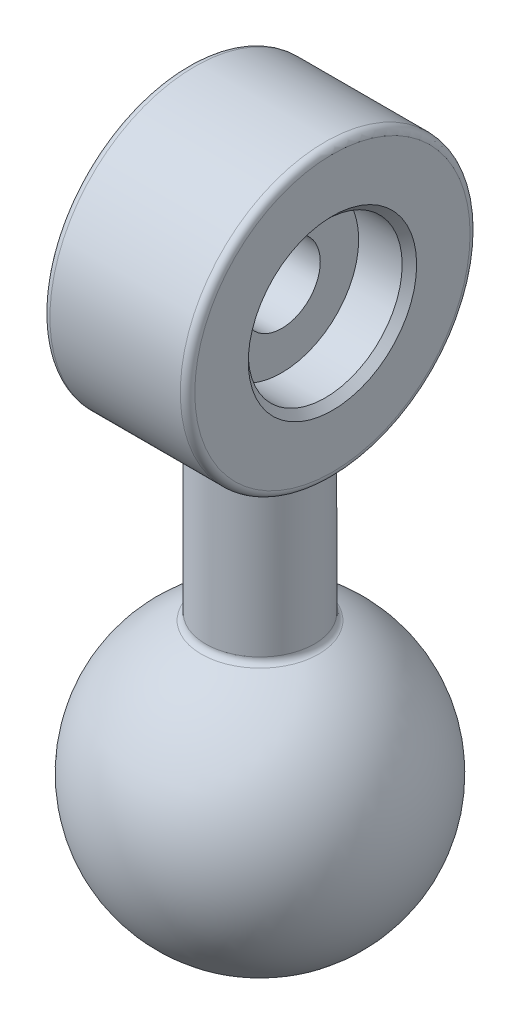
ISO-10303-21;
HEADER;
FILE_DESCRIPTION(('STEP AP214'),'2;1');
FILE_NAME('part.step','',(''),(''),'','','');
FILE_SCHEMA(('AUTOMOTIVE_DESIGN { 1 0 10303 214 1 1 1 1 }'));
ENDSEC;
DATA;
#1=APPLICATION_CONTEXT('core data for automotive mechanical design processes');
#2=APPLICATION_PROTOCOL_DEFINITION('international standard','automotive_design',2000,#1);
#3=PRODUCT_CONTEXT('',#1,'mechanical');
#4=PRODUCT('Part','Part','',(#3));
#5=PRODUCT_RELATED_PRODUCT_CATEGORY('part','',(#4));
#6=PRODUCT_DEFINITION_FORMATION('','',#4);
#7=PRODUCT_DEFINITION_CONTEXT('part definition',#1,'design');
#8=PRODUCT_DEFINITION('design','',#6,#7);
#9=PRODUCT_DEFINITION_SHAPE('','',#8);
#10=(LENGTH_UNIT() NAMED_UNIT(*) SI_UNIT(.MILLI.,.METRE.));
#11=(NAMED_UNIT(*) PLANE_ANGLE_UNIT() SI_UNIT($,.RADIAN.));
#12=(NAMED_UNIT(*) SI_UNIT($,.STERADIAN.) SOLID_ANGLE_UNIT());
#13=UNCERTAINTY_MEASURE_WITH_UNIT(LENGTH_MEASURE(1.E-05),#10,'distance_accuracy_value','');
#14=(GEOMETRIC_REPRESENTATION_CONTEXT(3) GLOBAL_UNCERTAINTY_ASSIGNED_CONTEXT((#13)) GLOBAL_UNIT_ASSIGNED_CONTEXT((#10,
#11,#12)) REPRESENTATION_CONTEXT('',''));
#15=CARTESIAN_POINT('',(0.,0.,0.));
#16=DIRECTION('',(0.,0.,1.));
#17=DIRECTION('',(1.,0.,0.));
#18=AXIS2_PLACEMENT_3D('',#15,#16,#17);
#19=CARTESIAN_POINT('',(0.,12.7,0.));
#20=DIRECTION('',(0.,-1.,0.));
#21=DIRECTION('',(1.,0.,0.));
#22=AXIS2_PLACEMENT_3D('',#19,#20,#21);
#23=CYLINDRICAL_SURFACE('',#22,4.7625);
#24=CARTESIAN_POINT('',(0.,12.1938188747414,0.));
#25=DIRECTION('',(0.,-1.,0.));
#26=DIRECTION('',(1.,0.,0.));
#27=AXIS2_PLACEMENT_3D('',#24,#25,#26);
#28=CIRCLE('',#27,4.7625);
#29=CARTESIAN_POINT('',(4.7625,12.1938188747414,0.));
#30=VERTEX_POINT('',#29);
#31=EDGE_CURVE('E93',#30,#30,#28,.F.);
#32=ORIENTED_EDGE('',*,*,#31,.T.);
#33=EDGE_LOOP('',(#32));
#34=FACE_BOUND('',#33,.T.);
#35=CARTESIAN_POINT('',(4.76160021114497,24.7654127276796,0.0925725619404737));
#36=CARTESIAN_POINT('',(4.76169728884381,25.4002959809423,0.0875792336624714));
#37=CARTESIAN_POINT('',(5.39648023929763,25.4003930739805,0.0999195906659081));
#38=CARTESIAN_POINT('',(4.75671349722739,24.7676521384673,0.34398511734036));
#39=CARTESIAN_POINT('',(4.75733065655545,25.4019054404997,0.32536694928873));
#40=CARTESIAN_POINT('',(5.39094196351998,25.4025258461416,0.371285523477689));
#41=CARTESIAN_POINT('',(4.73184615421316,24.779104108414,0.594922440310121));
#42=CARTESIAN_POINT('',(4.73535906975175,25.4100339643585,0.562187155455623));
#43=CARTESIAN_POINT('',(5.36275897479677,25.4134324842582,0.642138507000814));
#44=CARTESIAN_POINT('',(4.64318089462739,24.8192389613458,1.08867277054386));
#45=CARTESIAN_POINT('',(4.65556998617361,25.4391292165822,1.03276221560952));
#46=CARTESIAN_POINT('',(5.26227168060252,25.451656153727,1.17507537138074));
#47=CARTESIAN_POINT('',(4.57938242883946,24.8479220874173,1.33148566314239));
#48=CARTESIAN_POINT('',(4.59825696620242,25.4599136751024,1.26509565989003));
#49=CARTESIAN_POINT('',(5.18996675268622,25.4789734165902,1.43715912847165));
#50=CARTESIAN_POINT('',(4.41519911832528,24.9196804027605,1.80270128618317));
#51=CARTESIAN_POINT('',(4.44762658824141,25.5131925412687,1.72170972134861));
#52=CARTESIAN_POINT('',(5.00389233410048,25.5473146692934,1.94577281683213));
#53=CARTESIAN_POINT('',(4.31479686422814,24.9627624395807,2.03109709888135));
#54=CARTESIAN_POINT('',(4.35509046453569,25.5454229073273,1.94502683616064));
#55=CARTESIAN_POINT('',(4.89010311281071,25.5883451806082,2.19229528133033));
#56=CARTESIAN_POINT('',(4.08056481885774,25.0592465381688,2.46818364783341));
#57=CARTESIAN_POINT('',(4.13476584976329,25.6193052093867,2.37775918044391));
#58=CARTESIAN_POINT('',(4.62464012805923,25.6802347983012,2.66407123893372));
#59=CARTESIAN_POINT('',(3.94672526574617,25.1126516126595,2.67686860504849));
#60=CARTESIAN_POINT('',(4.00783395725522,25.6607071983308,2.58678424480375));
#61=CARTESIAN_POINT('',(4.47295530118076,25.7310967739391,2.88931849434626));
#62=CARTESIAN_POINT('',(3.63962420134126,25.2285003731643,3.0827467709815));
#63=CARTESIAN_POINT('',(3.71160655619891,25.752241337624,2.99734247942161));
#64=CARTESIAN_POINT('',(4.12490742818487,25.8414289268468,3.32740921311417));
#65=CARTESIAN_POINT('',(3.4644061707386,25.2913019500108,3.27838077100381));
#66=CARTESIAN_POINT('',(3.54080478140343,25.8026425431375,3.19798137953026));
#67=CARTESIAN_POINT('',(3.92632699351909,25.9012399525402,3.53856972105023));
#68=CARTESIAN_POINT('',(3.08419416457309,25.4167541407614,3.63837126172373));
#69=CARTESIAN_POINT('',(3.16482052103659,25.9048593269133,3.56995700381185));
#70=CARTESIAN_POINT('',(3.49542005319971,26.0207182293587,3.9271308856708));
#71=CARTESIAN_POINT('',(2.87918746982788,25.4794046784994,3.80271432219471));
#72=CARTESIAN_POINT('',(2.96008196465791,25.9566935937198,3.74196702142598));
#73=CARTESIAN_POINT('',(3.26307913247276,26.0803854079446,4.10451704623769));
#74=CARTESIAN_POINT('',(2.43433692973659,25.6004601238947,4.10248714434976));
#75=CARTESIAN_POINT('',(2.51160872839779,26.0577403523314,4.05681122410529));
#76=CARTESIAN_POINT('',(2.75891518703359,26.1956763086277,4.42808136209344));
#77=CARTESIAN_POINT('',(2.19336601197279,25.6585620354233,4.23634926571035));
#78=CARTESIAN_POINT('',(2.26632315294292,26.106997209439,4.19922188654344));
#79=CARTESIAN_POINT('',(2.48581481358261,26.2510114630156,4.57256746114965));
#80=CARTESIAN_POINT('',(1.689904907561,25.7598716057473,4.46111197614404));
#81=CARTESIAN_POINT('',(1.75095608719781,26.1931830046256,4.43834805008958));
#82=CARTESIAN_POINT('',(1.91522556191862,26.3474967681029,4.81516848193267));
#83=CARTESIAN_POINT('',(1.42742579842872,25.8030868727705,4.5520345195068));
#84=CARTESIAN_POINT('',(1.48012903558784,26.2304571521496,4.5361751650174));
#85=CARTESIAN_POINT('',(1.61774923822344,26.3886541647342,4.91330710035291));
#86=CARTESIAN_POINT('',(0.901691616315077,25.8668400183897,4.68382063374012));
#87=CARTESIAN_POINT('',(0.936732135078477,26.2853584225207,4.67753636481585));
#88=CARTESIAN_POINT('',(1.02191716515306,26.4493714459038,5.05555243013259));
#89=CARTESIAN_POINT('',(0.639087614375632,25.8883732879622,4.72689192516858));
#90=CARTESIAN_POINT('',(0.663777969262695,26.3041010872507,4.72414403648034));
#91=CARTESIAN_POINT('',(0.724299296291312,26.4698793218159,5.10204207797858));
#92=CARTESIAN_POINT('',(0.109776610150447,25.9092254310623,4.76862424884515));
#93=CARTESIAN_POINT('',(0.114421892636814,26.322150825222,4.76905658178594));
#94=CARTESIAN_POINT('',(0.124413491504909,26.4897385058265,5.14708649079815));
#95=CARTESIAN_POINT('',(-0.156928347761278,25.9085550360591,4.7673067350731));
#96=CARTESIAN_POINT('',(-0.163440299278602,26.3215645185828,4.76762658028095));
#97=CARTESIAN_POINT('',(-0.177852127462522,26.4891000343717,5.14566441244833));
#98=CARTESIAN_POINT('',(-0.667039893605834,25.8859438258853,4.72200566546161));
#99=CARTESIAN_POINT('',(-0.692740492424099,26.3019991789572,4.71888603541801));
#100=CARTESIAN_POINT('',(-0.755978546086853,26.4675655484345,5.09676801987404));
#101=CARTESIAN_POINT('',(-0.910766103338871,25.8655018956856,4.68102856770365));
#102=CARTESIAN_POINT('',(-0.945923880446525,26.2842252088083,4.67458151548522));
#103=CARTESIAN_POINT('',(-1.03220158378406,26.4480970434491,5.05253877151469));
#104=CARTESIAN_POINT('',(-1.26809870901329,25.8225204005734,4.59221784290909));
#105=CARTESIAN_POINT('',(-1.31459403862944,26.2472794724181,4.57950642927386));
#106=CARTESIAN_POINT('',(-1.43717853688172,26.4071622862909,4.95667957646077));
#107=CARTESIAN_POINT('',(-1.38586862371241,25.8061331562759,4.5580419432182));
#108=CARTESIAN_POINT('',(-1.43617066958828,26.2331751323223,4.5428481195451));
#109=CARTESIAN_POINT('',(-1.57065110687412,26.391555387014,4.91979130375615));
#110=CARTESIAN_POINT('',(-1.61813089275028,25.7697380566573,4.48085245280992));
#111=CARTESIAN_POINT('',(-1.67536979592012,26.2019693954162,4.46029899271183));
#112=CARTESIAN_POINT('',(-1.8338816784504,26.3568933873759,4.8364756633159));
#113=CARTESIAN_POINT('',(-1.73262067704509,25.7497274476186,4.437832137043));
#114=CARTESIAN_POINT('',(-1.79308523415219,26.1848370610692,4.4143193509933));
#115=CARTESIAN_POINT('',(-1.96363676731782,26.3378356644264,4.79004103679667));
#116=CARTESIAN_POINT('',(-2.07512541812269,25.6841091085173,4.29388460646487));
#117=CARTESIAN_POINT('',(-2.14520041136046,26.1287428835067,4.26052385886539));
#118=CARTESIAN_POINT('',(-2.3518088072056,26.275342008055,4.63466909906525));
#119=CARTESIAN_POINT('',(-2.29685841974343,25.6335902913298,4.17939597175186));
#120=CARTESIAN_POINT('',(-2.37149614020674,26.085801680724,4.13856898321141));
#121=CARTESIAN_POINT('',(-2.60310620904217,26.2272288488883,4.51109406474882));
#122=CARTESIAN_POINT('',(-2.71880121185712,25.525055109278,3.91805940138155));
#123=CARTESIAN_POINT('',(-2.79863736268247,25.9947473339972,3.86312406636827));
#124=CARTESIAN_POINT('',(-3.08130804010512,26.1238620088335,4.22901649672851));
#125=CARTESIAN_POINT('',(-2.91900120141325,25.4670353565322,3.77119682240669));
#126=CARTESIAN_POINT('',(-2.99964083101476,25.9464383600981,3.70879848936023));
#127=CARTESIAN_POINT('',(-3.30820136160311,26.0686051013915,4.07049815753902));
#128=CARTESIAN_POINT('',(-3.2076263060765,25.3763001446219,3.5228386233767));
#129=CARTESIAN_POINT('',(-3.28573117193371,25.8722136463573,3.45180179626927));
#130=CARTESIAN_POINT('',(-3.63530981355259,25.9821906139622,3.80242899030018));
#131=CARTESIAN_POINT('',(-3.30512809180557,25.3442129467699,3.4315223695185));
#132=CARTESIAN_POINT('',(-3.38216722006003,25.8460435097226,3.35731407836072));
#133=CARTESIAN_POINT('',(-3.74581183737738,25.951631377988,3.70386541468373));
#134=CARTESIAN_POINT('',(-3.49207404986882,25.2803941545397,3.24108342155801));
#135=CARTESIAN_POINT('',(-3.56609510644504,25.7943696222559,3.16137022274871));
#136=CARTESIAN_POINT('',(-3.95768392318859,25.8908515758677,3.49831226450775));
#137=CARTESIAN_POINT('',(-3.58152573349093,25.2486622533736,3.14196816978912));
#138=CARTESIAN_POINT('',(-3.65352177567541,25.7688683203577,3.05984181168535));
#139=CARTESIAN_POINT('',(-4.059062497968,25.8606307175429,3.39133072294296));
#140=CARTESIAN_POINT('',(-3.83718140487939,25.1552004517544,2.83349383987905));
#141=CARTESIAN_POINT('',(-3.90312353668402,25.6940089326229,2.7443220636457));
#142=CARTESIAN_POINT('',(-4.34880559221071,25.7716194777772,3.05837430339784));
#143=CARTESIAN_POINT('',(-3.99073171839862,25.0951894801341,2.6129668238656));
#144=CARTESIAN_POINT('',(-4.04966769469722,25.6470983032872,2.52209644298531));
#145=CARTESIAN_POINT('',(-4.52282928084004,25.7144661715013,2.82034514322896));
#146=CARTESIAN_POINT('',(-4.26168239235133,24.9852673376999,2.1434300294371));
#147=CARTESIAN_POINT('',(-4.30594331014163,25.562350494022,2.05505006722837));
#148=CARTESIAN_POINT('',(-4.82990671134346,25.609778416913,2.31354352382776));
#149=CARTESIAN_POINT('',(-4.37837817109444,24.9355586225651,1.89397697810266));
#150=CARTESIAN_POINT('',(-4.41377599957116,25.5250254077952,1.81033943415483));
#151=CARTESIAN_POINT('',(-4.96216192730316,25.5624367835341,2.04429261128632));
#152=CARTESIAN_POINT('',(-4.56748116710627,24.8532901735679,1.37668438474408));
#153=CARTESIAN_POINT('',(-4.58766762292129,25.4637683090104,1.30809698859467));
#154=CARTESIAN_POINT('',(-5.17647865611912,25.4840858797159,1.48594505020631));
#155=CARTESIAN_POINT('',(-4.63990055330905,24.8207257281123,1.10884991720158));
#156=CARTESIAN_POINT('',(-4.65264056456864,25.4401999310082,1.05179149052638));
#157=CARTESIAN_POINT('',(-5.25855396043399,25.4530721220451,1.19685387888603));
#158=CARTESIAN_POINT('',(-4.73831547845026,24.7761736751352,0.556901892015311));
#159=CARTESIAN_POINT('',(-4.7412258662538,25.4078920596229,0.525738239229741));
#160=CARTESIAN_POINT('',(-5.3700908755595,25.4106415953327,0.601100454871842));
#161=CARTESIAN_POINT('',(-4.76318779690183,24.7646841758373,0.272554266767622));
#162=CARTESIAN_POINT('',(-4.76311351557422,25.3997733666098,0.257907104336385));
#163=CARTESIAN_POINT('',(-5.39827950315317,25.3996992150783,0.29418555778018));
#164=CARTESIAN_POINT('',(-4.76178339040902,24.7653290413657,-0.295982573889904));
#165=CARTESIAN_POINT('',(-4.76186085645971,25.4002360836341,-0.280038905807839));
#166=CARTESIAN_POINT('',(-5.39668784246586,25.4003133727343,-0.319473254356612));
#167=CARTESIAN_POINT('',(-4.73551150415836,24.7774611713773,-0.580171801741082));
#168=CARTESIAN_POINT('',(-4.73873565750958,25.4088118980357,-0.547793795621143));
#169=CARTESIAN_POINT('',(-5.36691303803774,25.4118677822495,-0.626217182830492));
#170=CARTESIAN_POINT('',(-4.63669907835069,24.822157179617,-1.11913455758296));
#171=CARTESIAN_POINT('',(-4.6497320863497,25.4412488423844,-1.06175282606127));
#172=CARTESIAN_POINT('',(-5.25492562213862,25.4544354091727,-1.20795476056681));
#173=CARTESIAN_POINT('',(-4.56737946373317,24.8532963446609,-1.37460269049351));
#174=CARTESIAN_POINT('',(-4.58746775520272,25.4638140743519,-1.30634120672829));
#175=CARTESIAN_POINT('',(-5.1763633922632,25.4840917568769,-1.48369814212348));
#176=CARTESIAN_POINT('',(-4.38835681362064,24.9312533596625,-1.86891588224196));
#177=CARTESIAN_POINT('',(-4.42292566974529,25.5218254434385,-1.78608884855324));
#178=CARTESIAN_POINT('',(-4.97347105546782,25.5583365330687,-2.01724253956527));
#179=CARTESIAN_POINT('',(-4.27865226502484,24.978071797069,-2.10776031784169));
#180=CARTESIAN_POINT('',(-4.32159770069624,25.5569531854689,-2.02017169610945));
#181=CARTESIAN_POINT('',(-4.84913923370029,25.6029255210314,-2.27504288274886));
#182=CARTESIAN_POINT('',(-4.02297307700022,25.0823621972909,-2.56221205192086));
#183=CARTESIAN_POINT('',(-4.08025689826934,25.6371593947172,-2.47143524269704));
#184=CARTESIAN_POINT('',(-4.55936948726146,25.7022497116923,-2.76556221477262));
#185=CARTESIAN_POINT('',(-3.8770950990701,25.1398056659361,-2.77787911758332));
#186=CARTESIAN_POINT('',(-3.94135161076518,25.6819264496989,-2.68828528263316));
#187=CARTESIAN_POINT('',(-4.39404111228858,25.7569577770854,-2.99834571422301));
#188=CARTESIAN_POINT('',(-3.55289868772431,25.2597217892287,-3.18205522327389));
#189=CARTESIAN_POINT('',(-3.62707464348508,25.7772464383371,-3.0988967102396));
#190=CARTESIAN_POINT('',(-4.02661851276722,25.8711636087863,-3.4345992886238));
#191=CARTESIAN_POINT('',(-3.3745709159211,25.3221958886962,-3.37055641746374));
#192=CARTESIAN_POINT('',(-3.45247099920679,25.8276610151511,-3.29292313112838));
#193=CARTESIAN_POINT('',(-3.82451370471284,25.9306627511133,-3.63806089505036));
#194=CARTESIAN_POINT('',(-2.98064842274342,25.4488054217339,-3.72429754530806));
#195=CARTESIAN_POINT('',(-3.06171624166185,25.931232448334,-3.65938461830518));
#196=CARTESIAN_POINT('',(-3.37806821244018,26.0512432588213,-4.01987671556));
#197=CARTESIAN_POINT('',(-2.76371644993035,25.5128850200816,-3.88806798247855));
#198=CARTESIAN_POINT('',(-2.84426840957751,25.9845059542201,-3.83137324777994));
#199=CARTESIAN_POINT('',(-3.13221197659228,26.1122714478046,-4.19664480645312));
#200=CARTESIAN_POINT('',(-2.30378269667533,25.6323584005888,-4.17704685875705));
#201=CARTESIAN_POINT('',(-2.37895417821794,26.0846611578281,-4.13579975299356));
#202=CARTESIAN_POINT('',(-2.61095372290533,26.2260556197171,-4.50855851418356));
#203=CARTESIAN_POINT('',(-2.06078224177615,25.6877526240343,-4.30225725733254));
#204=CARTESIAN_POINT('',(-2.13088936306586,26.1317915988854,-4.26931411595869));
#205=CARTESIAN_POINT('',(-2.33555320734807,26.2788120229186,-4.64370624600166));
#206=CARTESIAN_POINT('',(-1.5569350459844,25.7823561765027,-4.50897154025487));
#207=CARTESIAN_POINT('',(-1.61404162795298,26.2124873815621,-4.48963435128619));
#208=CARTESIAN_POINT('',(-1.76452638544724,26.3689106442597,-4.86682642441008));
#209=CARTESIAN_POINT('',(-1.2962591145134,25.8217001552185,-4.59084083038273));
#210=CARTESIAN_POINT('',(-1.34464731440635,26.246488884981,-4.57782721363825));
#211=CARTESIAN_POINT('',(-1.4690936631147,26.4063811002009,-4.95519327724048));
#212=CARTESIAN_POINT('',(-0.763068407396265,25.8792389471773,-4.70887934454273));
#213=CARTESIAN_POINT('',(-0.793076151929948,26.2960895335436,-4.70451691291247));
#214=CARTESIAN_POINT('',(-0.864810861716258,26.4611799496999,-5.08259992744096));
#215=CARTESIAN_POINT('',(-0.490562618869457,25.8974495335178,-4.745082653547));
#216=CARTESIAN_POINT('',(-0.509549952911788,26.3119618203602,-4.74373231377325));
#217=CARTESIAN_POINT('',(-0.555970968052261,26.4785233652551,-5.12167651493967));
#218=CARTESIAN_POINT('',(0.035416278730027,25.9094698039888,-4.76906074639504));
#219=CARTESIAN_POINT('',(0.0365504375934303,26.3223771357628,-4.76955869134069));
#220=CARTESIAN_POINT('',(0.0401384492275568,26.4899712418941,-5.14755763102951));
#221=CARTESIAN_POINT('',(0.288699121021072,25.9050873392194,-4.76042320016322));
#222=CARTESIAN_POINT('',(0.300319664905804,26.3185532630156,-4.76019727882508));
#223=CARTESIAN_POINT('',(0.32719233715754,26.4857974659292,-5.13823456525366));
#224=CARTESIAN_POINT('',(0.789805850299065,25.8766632136489,-4.70332088065582));
#225=CARTESIAN_POINT('',(0.820135290896056,26.2939612964592,-4.69876232511961));
#226=CARTESIAN_POINT('',(0.895113297005281,26.4587268701358,-5.07660031563039));
#227=CARTESIAN_POINT('',(1.03762968743884,25.8526213734109,-4.65485574386195));
#228=CARTESIAN_POINT('',(1.07740361195584,26.2730753212356,-4.6463929682494));
#229=CARTESIAN_POINT('',(1.17598031242958,26.4358298794151,-5.02428873941401));
#230=CARTESIAN_POINT('',(1.51586984390942,25.7886350400067,-4.52148848311657));
#231=CARTESIAN_POINT('',(1.57103082704111,26.2180663255292,-4.5035118427594));
#232=CARTESIAN_POINT('',(1.71798582309843,26.3748905143154,-4.88033677542011));
#233=CARTESIAN_POINT('',(1.74654332267429,25.7490372703599,-4.43737783469318));
#234=CARTESIAN_POINT('',(1.80865705287863,26.1840083870115,-4.41321895450279));
#235=CARTESIAN_POINT('',(1.97941576570151,26.3371783528103,-4.78955067868933));
#236=CARTESIAN_POINT('',(2.07954935172759,25.681127158277,-4.28623323221949));
#237=CARTESIAN_POINT('',(2.14841434622565,26.1264269684226,-4.25293683405351));
#238=CARTESIAN_POINT('',(2.35682259862678,26.2725020556159,-4.6264104728318));
#239=CARTESIAN_POINT('',(2.18841518335236,25.6570629139467,-4.23166815764133));
#240=CARTESIAN_POINT('',(2.25950818398707,26.1060170216739,-4.1949761972627));
#241=CARTESIAN_POINT('',(2.48020387446656,26.2495837276801,-4.56751483677769));
#242=CARTESIAN_POINT('',(2.40144771282884,25.606697144144,-4.1145156166853));
#243=CARTESIAN_POINT('',(2.47617194716513,26.0635086371442,-4.07100144658987));
#244=CARTESIAN_POINT('',(2.72164074120547,26.2016163278226,-4.44106447512634));
#245=CARTESIAN_POINT('',(2.50561025545854,25.5803936973791,-4.05192123714274));
#246=CARTESIAN_POINT('',(2.58177428251924,26.0413828248686,-4.00488377516094));
#247=CARTESIAN_POINT('',(2.83969162285301,26.1765654260984,-4.37350228770057));
#248=CARTESIAN_POINT('',(2.82428438314505,25.4953368933358,-3.84344982490844));
#249=CARTESIAN_POINT('',(2.90490761285503,25.969947304423,-3.78468237903182));
#250=CARTESIAN_POINT('',(3.20085563423106,26.0955589459846,-4.14848552531734));
#251=CARTESIAN_POINT('',(3.02944295802602,25.433727262574,-3.68387602264454));
#252=CARTESIAN_POINT('',(3.11021037109956,25.9188494760525,-3.6174076528212));
#253=CARTESIAN_POINT('',(3.43336868576037,26.0368831072064,-3.97624713555517));
#254=CARTESIAN_POINT('',(3.41106979640655,25.3097236151203,-3.33363211514625));
#255=CARTESIAN_POINT('',(3.48838439798186,25.8175531014722,-3.25487743920013));
#256=CARTESIAN_POINT('',(3.86587910259656,25.9187843953596,-3.59820609253648));
#257=CARTESIAN_POINT('',(3.58753210233346,25.2473294384395,-3.14295556915258));
#258=CARTESIAN_POINT('',(3.66084573762264,25.7673200639599,-3.05892044018675));
#259=CARTESIAN_POINT('',(4.06586971598777,25.8593613699208,-3.39239648734933));
#260=CARTESIAN_POINT('',(3.83197145315408,25.1562035213272,-2.83128228755551));
#261=CARTESIAN_POINT('',(3.89638353927827,25.6953411747511,-2.74409105548119));
#262=CARTESIAN_POINT('',(4.34290098023609,25.7725747822278,-3.055987231007));
#263=CARTESIAN_POINT('',(3.91183803506605,25.1254846333534,-2.71988116497078));
#264=CARTESIAN_POINT('',(3.97303781740484,25.6712077897485,-2.63172096349193));
#265=CARTESIAN_POINT('',(4.43341643972631,25.7433186984686,-2.93574474947544));
#266=CARTESIAN_POINT('',(4.06181643457574,25.066424682189,-2.49034526353326));
#267=CARTESIAN_POINT('',(4.11614758427143,25.6251729983031,-2.40164596938128));
#268=CARTESIAN_POINT('',(4.60339195920125,25.6870711259796,-2.68799171300928));
#269=CARTESIAN_POINT('',(4.13193715122157,25.0380814592691,-2.37221676834743));
#270=CARTESIAN_POINT('',(4.18247575233751,25.6033034533194,-2.2839573066583));
#271=CARTESIAN_POINT('',(4.68286210477378,25.6600775803648,-2.56048794044533));
#272=CARTESIAN_POINT('',(4.26191596422415,24.9845488874036,-2.12987773026774));
#273=CARTESIAN_POINT('',(4.30473470257192,25.5623119013274,-2.04402518432444));
#274=CARTESIAN_POINT('',(4.83017142617778,25.6090941785638,-2.2989156453817));
#275=CARTESIAN_POINT('',(4.32177257953607,24.9593599937488,-2.00566631296542));
#276=CARTESIAN_POINT('',(4.36051604903449,25.5432332382316,-1.92184654692461));
#277=CARTESIAN_POINT('',(4.89800892349179,25.5851047559881,-2.16484617907606));
#278=CARTESIAN_POINT('',(4.43066508930617,24.9128608785208,-1.75205372250428));
#279=CARTESIAN_POINT('',(4.46148541107622,25.508252727876,-1.67379481282613));
#280=CARTESIAN_POINT('',(5.02142043453113,25.5408198842913,-1.89110560523748));
#281=CARTESIAN_POINT('',(4.4796990350779,24.8915513555723,-1.62265161968015));
#282=CARTESIAN_POINT('',(4.50652502261152,25.4923982280597,-1.5480412577313));
#283=CARTESIAN_POINT('',(5.07699223974515,25.5205251005272,-1.75143349425629));
#284=CARTESIAN_POINT('',(4.60657630664168,24.8358367951878,-1.23767836388544));
#285=CARTESIAN_POINT('',(4.62300555202934,25.4510335896133,-1.17468476595074));
#286=CARTESIAN_POINT('',(5.22078648087943,25.4674636144989,-1.33590680546682));
#287=CARTESIAN_POINT('',(4.66911219189657,24.8075519829106,-0.976123160799531));
#288=CARTESIAN_POINT('',(4.67892924362087,25.4306453472677,-0.92515592957113));
#289=CARTESIAN_POINT('',(5.29166048420095,25.4405256981583,-1.05359325292564));
#290=CARTESIAN_POINT('',(4.74922490993606,24.7711480071379,-0.445337778886643));
#291=CARTESIAN_POINT('',(4.75086679542421,25.4043224479337,-0.420286048501001));
#292=CARTESIAN_POINT('',(5.38245489797195,25.4058552450337,-0.480682047049408));
#293=CARTESIAN_POINT('',(4.76682262652465,24.763019476604,-0.176111223955646));
#294=CARTESIAN_POINT('',(4.76636789717581,25.3985744814613,-0.166761689160895));
#295=CARTESIAN_POINT('',(5.40239897673263,25.3981137872609,-0.190088305221118));
#296=CARTESIAN_POINT('',(4.76160021114497,24.7654127276796,0.0925725619404737));
#297=CARTESIAN_POINT('',(4.76169728884381,25.4002959809423,0.0875792336624714));
#298=CARTESIAN_POINT('',(5.39648023929763,25.4003930739805,0.0999195906659081));
#299=(BOUNDED_SURFACE() B_SPLINE_SURFACE(3,2,((#35,#36,#37),(#38,#39,#40),(#41,#42,#43),(#44,
#45,#46),(#47,#48,#49),(#50,#51,#52),(#53,#54,#55),(#56,#57,#58),(#59,#60,#61),(#62,#63,#64),
(#65,#66,#67),(#68,#69,#70),(#71,#72,#73),(#74,#75,#76),(#77,#78,#79),(#80,#81,#82),(#83,#84,
#85),(#86,#87,#88),(#89,#90,#91),(#92,#93,#94),(#95,#96,#97),(#98,#99,#100),(#101,#102,#103),
(#104,#105,#106),(#107,#108,#109),(#110,#111,#112),(#113,#114,#115),(#116,#117,#118),(#119,#120,
#121),(#122,#123,#124),(#125,#126,#127),(#128,#129,#130),(#131,#132,#133),(#134,#135,#136),
(#137,#138,#139),(#140,#141,#142),(#143,#144,#145),(#146,#147,#148),(#149,#150,#151),(#152,#153,
#154),(#155,#156,#157),(#158,#159,#160),(#161,#162,#163),(#164,#165,#166),(#167,#168,#169),
(#170,#171,#172),(#173,#174,#175),(#176,#177,#178),(#179,#180,#181),(#182,#183,#184),(#185,#186,
#187),(#188,#189,#190),(#191,#192,#193),(#194,#195,#196),(#197,#198,#199),(#200,#201,#202),
(#203,#204,#205),(#206,#207,#208),(#209,#210,#211),(#212,#213,#214),(#215,#216,#217),(#218,#219,
#220),(#221,#222,#223),(#224,#225,#226),(#227,#228,#229),(#230,#231,#232),(#233,#234,#235),
(#236,#237,#238),(#239,#240,#241),(#242,#243,#244),(#245,#246,#247),(#248,#249,#250),(#251,#252,
#253),(#254,#255,#256),(#257,#258,#259),(#260,#261,#262),(#263,#264,#265),(#266,#267,#268),
(#269,#270,#271),(#272,#273,#274),(#275,#276,#277),(#278,#279,#280),(#281,#282,#283),(#284,#285,
#286),(#287,#288,#289),(#290,#291,#292),(#293,#294,#295),(#296,#297,#298)),.UNSPECIFIED.,.T.,
.F.,.F.) B_SPLINE_SURFACE_WITH_KNOTS((4,2,2,2,2,2,2,2,2,2,2,2,2,2,2,2,2,2,2,2,2,2,2,2,2,2,2,2,2,
2,2,2,2,2,2,2,2,2,2,2,2,2,2,4),(3,3),(0.,0.853928586728634,1.70786922043644,2.56221653351225,
3.41681356072201,4.32540740691213,5.23439035131962,6.18289162055205,7.13090741048461,
8.03308845381461,8.93483346161649,9.77317476742652,10.1926050824994,10.6123555082369,
11.4703778630547,12.3287891160911,12.7925987083927,13.2559709481665,14.1825080207736,
15.1258145907041,16.0688617853543,17.0339241895805,17.9988952948126,18.8991553751147,
19.7994491888608,20.6973627121765,21.5955350464932,22.5350368002253,23.4744908043418,
24.405892850837,25.3365992890485,26.1940465613062,27.0515016598279,27.8908404382167,
28.3107657996192,28.7310551709979,29.6297503792419,30.5286319261906,31.0032022761781,
31.4773364035539,31.9515388880179,32.4258266859512,33.3388417848739,34.251432507331),(0.,1.),
.UNSPECIFIED.) GEOMETRIC_REPRESENTATION_ITEM() RATIONAL_B_SPLINE_SURFACE(((1.,0.707160848230135,
1.),(1.,0.707453910728993,1.),(1.,0.708958216842692,1.),(1.,0.714169158077318,1.),(1.,
0.71787582426777,1.),(1.,0.726994239401257,1.),(1.,0.732406799529583,1.),(1.,0.744288267214419,
1.),(1.,0.750757483064555,1.),(1.,0.764496707371946,1.),(1.,0.771791486591032,1.),(1.,
0.78605263019961,1.),(1.,0.793018852610217,1.),(1.,0.806231992654335,1.),(1.,0.812434471400834,
1.),(1.,0.823099171821771,1.),(1.,0.827562282601556,1.),(1.,0.834099909168628,1.),(1.,
0.836279476258746,1.),(1.,0.838390623270339,1.),(1.,0.838323289163364,1.),(1.,0.83603300198623,
1.),(1.,0.833961948178457,1.),(1.,0.829555445344802,1.),(1.,0.827869234212412,1.),(1.,
0.824100687926908,1.),(1.,0.822018051432758,1.),(1.,0.815138230050233,1.),(1.,0.80977720147185,
1.),(1.,0.798033459071048,1.),(1.,0.791650283271627,1.),(1.,0.781460446332821,1.),(1.,
0.77781824189981,1.),(1.,0.770495167125061,1.),(1.,0.766814336482147,1.),(1.,0.755853318479263,
1.),(1.,0.748652921762682,1.),(1.,0.735214485294265,1.),(1.,0.728996222038207,1.),(1.,
0.718570313571615,1.),(1.,0.714362115983777,1.),(1.,0.708577798414478,1.),(1.,0.707065417024829,
1.),(1.,0.707149876885366,1.),(1.,0.708746424003447,1.),(1.,0.714546610121791,1.),(1.,
0.718568237615377,1.),(1.,0.728453259902828,1.),(1.,0.734316723703497,1.),(1.,0.74709931558544,
1.),(1.,0.754015611604732,1.),(1.,0.768135515441701,1.),(1.,0.775339205498375,1.),(1.,
0.789635081618673,1.),(1.,0.79670688385841,1.),(1.,0.809652706634727,1.),(1.,0.815526788029579,
1.),(1.,0.825431390694895,1.),(1.,0.829477281406746,1.),(1.,0.835360207898992,1.),(1.,
0.837198891083879,1.),(1.,0.838414250799757,1.),(1.,0.837973328361531,1.),(1.,0.835091250662498,
1.),(1.,0.832650077144802,1.),(1.,0.826067613635773,1.),(1.,0.821963333445093,1.),(1.,
0.814807125644119,1.),(1.,0.812254161430076,1.),(1.,0.806865737325998,1.),(1.,0.804030034474496,
1.),(1.,0.794774849251537,1.),(1.,0.787950181801032,1.),(1.,0.773909453259143,1.),(1.,
0.766693311308191,1.),(1.,0.755934417132631,1.),(1.,0.752265602489492,1.),(1.,0.745139349829422,
1.),(1.,0.741681720616039,1.),(1.,0.735089864094059,1.),(1.,0.731955683482981,1.),(1.,
0.726123053674794,1.),(1.,0.723424682971294,1.),(1.,0.716324409321784,1.),(1.,0.712655609363585,
1.),(1.,0.707917835158004,1.),(1.,0.706847653284194,1.),(1.,0.707160848230135,1.))) REPRESENTATION_ITEM('') SURFACE());
#300=CARTESIAN_POINT('',(4.76160021114497,24.7654127276796,0.0925725619404737));
#301=CARTESIAN_POINT('',(4.75671349722739,24.7676521384673,0.343985117340359));
#302=CARTESIAN_POINT('',(4.73184615421316,24.779104108414,0.594922440310121));
#303=CARTESIAN_POINT('',(4.64318089462739,24.8192389613458,1.08867277054386));
#304=CARTESIAN_POINT('',(4.57938242883946,24.8479220874173,1.33148566314239));
#305=CARTESIAN_POINT('',(4.41519911832528,24.9196804027605,1.80270128618317));
#306=CARTESIAN_POINT('',(4.31479686422814,24.9627624395807,2.03109709888135));
#307=CARTESIAN_POINT('',(4.08056481885774,25.0592465381688,2.46818364783341));
#308=CARTESIAN_POINT('',(3.94672526574617,25.1126516126595,2.67686860504849));
#309=CARTESIAN_POINT('',(3.63962420134126,25.2285003731643,3.0827467709815));
#310=CARTESIAN_POINT('',(3.4644061707386,25.2913019500108,3.27838077100381));
#311=CARTESIAN_POINT('',(3.08419416457309,25.4167541407614,3.63837126172373));
#312=CARTESIAN_POINT('',(2.87918746982788,25.4794046784994,3.80271432219471));
#313=CARTESIAN_POINT('',(2.43433692973659,25.6004601238947,4.10248714434976));
#314=CARTESIAN_POINT('',(2.19336601197279,25.6585620354233,4.23634926571035));
#315=CARTESIAN_POINT('',(1.689904907561,25.7598716057473,4.46111197614404));
#316=CARTESIAN_POINT('',(1.42742579842872,25.8030868727705,4.5520345195068));
#317=CARTESIAN_POINT('',(0.901691616315077,25.8668400183897,4.68382063374012));
#318=CARTESIAN_POINT('',(0.639087614375632,25.8883732879622,4.72689192516858));
#319=CARTESIAN_POINT('',(0.109776610150447,25.9092254310623,4.76862424884515));
#320=CARTESIAN_POINT('',(-0.156928347761278,25.9085550360591,4.7673067350731));
#321=CARTESIAN_POINT('',(-0.667039893605834,25.8859438258853,4.72200566546161));
#322=CARTESIAN_POINT('',(-0.910766103338871,25.8655018956856,4.68102856770365));
#323=CARTESIAN_POINT('',(-1.26809870901329,25.8225204005734,4.59221784290909));
#324=CARTESIAN_POINT('',(-1.38586862371241,25.8061331562759,4.5580419432182));
#325=CARTESIAN_POINT('',(-1.61813089275028,25.7697380566573,4.48085245280992));
#326=CARTESIAN_POINT('',(-1.73262067704509,25.7497274476186,4.437832137043));
#327=CARTESIAN_POINT('',(-2.07512541812269,25.6841091085173,4.29388460646487));
#328=CARTESIAN_POINT('',(-2.29685841974343,25.6335902913298,4.17939597175186));
#329=CARTESIAN_POINT('',(-2.71880121185712,25.525055109278,3.91805940138155));
#330=CARTESIAN_POINT('',(-2.91900120141325,25.4670353565322,3.77119682240669));
#331=CARTESIAN_POINT('',(-3.2076263060765,25.3763001446219,3.5228386233767));
#332=CARTESIAN_POINT('',(-3.30512809180557,25.3442129467699,3.4315223695185));
#333=CARTESIAN_POINT('',(-3.49207404986882,25.2803941545397,3.24108342155801));
#334=CARTESIAN_POINT('',(-3.58152573349093,25.2486622533736,3.14196816978912));
#335=CARTESIAN_POINT('',(-3.83718140487939,25.1552004517544,2.83349383987905));
#336=CARTESIAN_POINT('',(-3.99073171839862,25.0951894801341,2.6129668238656));
#337=CARTESIAN_POINT('',(-4.26168239235133,24.9852673376999,2.14343002943709));
#338=CARTESIAN_POINT('',(-4.37837817109444,24.9355586225651,1.89397697810266));
#339=CARTESIAN_POINT('',(-4.56748116710627,24.8532901735679,1.37668438474408));
#340=CARTESIAN_POINT('',(-4.63990055330905,24.8207257281123,1.10884991720158));
#341=CARTESIAN_POINT('',(-4.73831547845026,24.7761736751352,0.55690189201531));
#342=CARTESIAN_POINT('',(-4.76318779690183,24.7646841758373,0.272554266767622));
#343=CARTESIAN_POINT('',(-4.76178339040902,24.7653290413657,-0.295982573889903));
#344=CARTESIAN_POINT('',(-4.73551150415836,24.7774611713773,-0.580171801741082));
#345=CARTESIAN_POINT('',(-4.63669907835069,24.822157179617,-1.11913455758296));
#346=CARTESIAN_POINT('',(-4.56737946373317,24.8532963446609,-1.37460269049351));
#347=CARTESIAN_POINT('',(-4.38835681362064,24.9312533596625,-1.86891588224196));
#348=CARTESIAN_POINT('',(-4.27865226502484,24.978071797069,-2.10776031784169));
#349=CARTESIAN_POINT('',(-4.02297307700022,25.0823621972909,-2.56221205192086));
#350=CARTESIAN_POINT('',(-3.8770950990701,25.1398056659361,-2.77787911758332));
#351=CARTESIAN_POINT('',(-3.55289868772431,25.2597217892287,-3.18205522327389));
#352=CARTESIAN_POINT('',(-3.3745709159211,25.3221958886962,-3.37055641746374));
#353=CARTESIAN_POINT('',(-2.98064842274342,25.4488054217339,-3.72429754530806));
#354=CARTESIAN_POINT('',(-2.76371644993035,25.5128850200816,-3.88806798247855));
#355=CARTESIAN_POINT('',(-2.30378269667533,25.6323584005888,-4.17704685875705));
#356=CARTESIAN_POINT('',(-2.06078224177615,25.6877526240343,-4.30225725733254));
#357=CARTESIAN_POINT('',(-1.5569350459844,25.7823561765027,-4.50897154025487));
#358=CARTESIAN_POINT('',(-1.2962591145134,25.8217001552185,-4.59084083038273));
#359=CARTESIAN_POINT('',(-0.763068407396265,25.8792389471773,-4.70887934454273));
#360=CARTESIAN_POINT('',(-0.490562618869457,25.8974495335178,-4.745082653547));
#361=CARTESIAN_POINT('',(0.0354162787300271,25.9094698039888,-4.76906074639504));
#362=CARTESIAN_POINT('',(0.288699121021072,25.9050873392194,-4.76042320016322));
#363=CARTESIAN_POINT('',(0.789805850299065,25.8766632136489,-4.70332088065582));
#364=CARTESIAN_POINT('',(1.03762968743884,25.8526213734109,-4.65485574386195));
#365=CARTESIAN_POINT('',(1.51586984390942,25.7886350400067,-4.52148848311657));
#366=CARTESIAN_POINT('',(1.74654332267429,25.7490372703599,-4.43737783469318));
#367=CARTESIAN_POINT('',(2.07954935172759,25.681127158277,-4.28623323221949));
#368=CARTESIAN_POINT('',(2.18841518335236,25.6570629139467,-4.23166815764133));
#369=CARTESIAN_POINT('',(2.40144771282884,25.606697144144,-4.1145156166853));
#370=CARTESIAN_POINT('',(2.50561025545854,25.5803936973791,-4.05192123714274));
#371=CARTESIAN_POINT('',(2.82428438314505,25.4953368933358,-3.84344982490844));
#372=CARTESIAN_POINT('',(3.02944295802602,25.433727262574,-3.68387602264454));
#373=CARTESIAN_POINT('',(3.41106979640655,25.3097236151203,-3.33363211514625));
#374=CARTESIAN_POINT('',(3.58753210233346,25.2473294384395,-3.14295556915258));
#375=CARTESIAN_POINT('',(3.83197145315408,25.1562035213272,-2.83128228755551));
#376=CARTESIAN_POINT('',(3.91183803506605,25.1254846333534,-2.71988116497078));
#377=CARTESIAN_POINT('',(4.06181643457574,25.066424682189,-2.49034526353326));
#378=CARTESIAN_POINT('',(4.13193715122157,25.0380814592691,-2.37221676834743));
#379=CARTESIAN_POINT('',(4.26191596422415,24.9845488874036,-2.12987773026774));
#380=CARTESIAN_POINT('',(4.32177257953607,24.9593599937488,-2.00566631296542));
#381=CARTESIAN_POINT('',(4.43066508930617,24.9128608785208,-1.75205372250428));
#382=CARTESIAN_POINT('',(4.4796990350779,24.8915513555723,-1.62265161968015));
#383=CARTESIAN_POINT('',(4.60657630664168,24.8358367951878,-1.23767836388544));
#384=CARTESIAN_POINT('',(4.66911219189657,24.8075519829106,-0.97612316079953));
#385=CARTESIAN_POINT('',(4.74922490993606,24.7711480071379,-0.445337778886642));
#386=CARTESIAN_POINT('',(4.76682262652465,24.763019476604,-0.176111223955646));
#387=CARTESIAN_POINT('',(4.76160021114497,24.7654127276796,0.0925725619404737));
#388=B_SPLINE_CURVE_WITH_KNOTS('',3,(#300,#301,#302,#303,#304,#305,#306,#307,#308,#309,#310,
#311,#312,#313,#314,#315,#316,#317,#318,#319,#320,#321,#322,#323,#324,#325,#326,#327,#328,#329,
#330,#331,#332,#333,#334,#335,#336,#337,#338,#339,#340,#341,#342,#343,#344,#345,#346,#347,#348,
#349,#350,#351,#352,#353,#354,#355,#356,#357,#358,#359,#360,#361,#362,#363,#364,#365,#366,#367,
#368,#369,#370,#371,#372,#373,#374,#375,#376,#377,#378,#379,#380,#381,#382,#383,#384,#385,#386,
#387),.UNSPECIFIED.,.T.,.F.,(4,2,2,2,2,2,2,2,2,2,2,2,2,2,2,2,2,2,2,2,2,2,2,2,2,2,2,2,2,2,2,2,2,
2,2,2,2,2,2,2,2,2,2,4),(0.,0.853928586728634,1.70786922043644,2.56221653351225,3.41681356072201,
4.32540740691213,5.23439035131962,6.18289162055205,7.13090741048461,8.03308845381461,
8.93483346161649,9.77317476742652,10.1926050824994,10.6123555082369,11.4703778630547,
12.3287891160911,12.7925987083927,13.2559709481665,14.1825080207736,15.1258145907041,
16.0688617853543,17.0339241895805,17.9988952948126,18.8991553751147,19.7994491888608,
20.6973627121765,21.5955350464932,22.5350368002253,23.4744908043418,24.405892850837,
25.3365992890485,26.1940465613062,27.0515016598279,27.8908404382167,28.3107657996192,
28.7310551709979,29.6297503792419,30.5286319261906,31.0032022761781,31.4773364035539,
31.9515388880179,32.4258266859512,33.3388417848739,34.251432507331),.UNSPECIFIED.);
#389=CARTESIAN_POINT('',(4.76160021114497,24.7654127276796,0.0925725619404737));
#390=VERTEX_POINT('',#389);
#391=EDGE_CURVE('E85',#390,#390,#388,.T.);
#392=ORIENTED_EDGE('',*,*,#391,.T.);
#393=EDGE_LOOP('',(#392));
#394=FACE_BOUND('',#393,.T.);
#395=ADVANCED_FACE('F39',(#34,#394),#23,.T.);
#396=CARTESIAN_POINT('',(0.,0.,0.));
#397=DIRECTION('',(0.,-1.,0.));
#398=DIRECTION('',(-1.,0.,0.));
#399=AXIS2_PLACEMENT_3D('',#396,#397,#398);
#400=SPHERICAL_SURFACE('',#399,12.7);
#401=CARTESIAN_POINT('',(0.,11.6131608330871,0.));
#402=DIRECTION('',(0.,-1.,0.));
#403=DIRECTION('',(1.,0.,0.));
#404=AXIS2_PLACEMENT_3D('',#401,#402,#403);
#405=CIRCLE('',#404,5.14047619047619);
#406=CARTESIAN_POINT('',(5.14047619047619,11.6131608330871,0.));
#407=VERTEX_POINT('',#406);
#408=EDGE_CURVE('E94',#407,#407,#405,.T.);
#409=ORIENTED_EDGE('',*,*,#408,.T.);
#410=EDGE_LOOP('',(#409));
#411=FACE_BOUND('',#410,.T.);
#412=ADVANCED_FACE('F81',(#411),#400,.T.);
#413=CARTESIAN_POINT('',(6.35,38.1,0.));
#414=DIRECTION('',(-1.,0.,0.));
#415=DIRECTION('',(0.,0.,1.));
#416=AXIS2_PLACEMENT_3D('',#413,#414,#415);
#417=CYLINDRICAL_SURFACE('',#416,12.7);
#418=CARTESIAN_POINT('',(5.715,38.1,0.));
#419=DIRECTION('',(1.,0.,0.));
#420=DIRECTION('',(0.,0.,-1.));
#421=AXIS2_PLACEMENT_3D('',#418,#419,#420);
#422=CIRCLE('',#421,12.7);
#423=CARTESIAN_POINT('',(5.715,38.1,-12.7));
#424=VERTEX_POINT('',#423);
#425=EDGE_CURVE('E48',#424,#424,#422,.F.);
#426=ORIENTED_EDGE('',*,*,#425,.T.);
#427=EDGE_LOOP('',(#426));
#428=FACE_BOUND('',#427,.T.);
#429=CARTESIAN_POINT('',(-5.715,38.1,0.));
#430=DIRECTION('',(1.,0.,0.));
#431=DIRECTION('',(0.,0.,-1.));
#432=AXIS2_PLACEMENT_3D('',#429,#430,#431);
#433=CIRCLE('',#432,12.7);
#434=CARTESIAN_POINT('',(-5.715,38.1,-12.7));
#435=VERTEX_POINT('',#434);
#436=EDGE_CURVE('E54',#435,#435,#433,.T.);
#437=ORIENTED_EDGE('',*,*,#436,.T.);
#438=EDGE_LOOP('',(#437));
#439=FACE_BOUND('',#438,.T.);
#440=CARTESIAN_POINT('',(5.39648023929763,25.4003930739805,0.0999195906659081));
#441=CARTESIAN_POINT('',(5.40239897673263,25.3981137872609,-0.190088305221118));
#442=CARTESIAN_POINT('',(5.38245489797195,25.4058552450337,-0.480682047049406));
#443=CARTESIAN_POINT('',(5.29166048420095,25.4405256981583,-1.05359325292564));
#444=CARTESIAN_POINT('',(5.22078648087943,25.4674636144989,-1.33590680546682));
#445=CARTESIAN_POINT('',(5.07699223974515,25.5205251005272,-1.75143349425629));
#446=CARTESIAN_POINT('',(5.02142043453113,25.5408198842913,-1.89110560523748));
#447=CARTESIAN_POINT('',(4.89800892349179,25.5851047559881,-2.16484617907606));
#448=CARTESIAN_POINT('',(4.83017142617778,25.6090941785638,-2.2989156453817));
#449=CARTESIAN_POINT('',(4.68286210477378,25.6600775803648,-2.56048794044533));
#450=CARTESIAN_POINT('',(4.60339195920126,25.6870711259796,-2.68799171300928));
#451=CARTESIAN_POINT('',(4.43341643972632,25.7433186984686,-2.93574474947544));
#452=CARTESIAN_POINT('',(4.34290098023609,25.7725747822278,-3.055987231007));
#453=CARTESIAN_POINT('',(4.06586971598777,25.8593613699208,-3.39239648734933));
#454=CARTESIAN_POINT('',(3.86587910259656,25.9187843953596,-3.59820609253648));
#455=CARTESIAN_POINT('',(3.43336868576037,26.0368831072064,-3.97624713555517));
#456=CARTESIAN_POINT('',(3.20085563423107,26.0955589459846,-4.14848552531734));
#457=CARTESIAN_POINT('',(2.83969162285301,26.1765654260984,-4.37350228770057));
#458=CARTESIAN_POINT('',(2.72164074120547,26.2016163278226,-4.44106447512634));
#459=CARTESIAN_POINT('',(2.48020387446656,26.2495837276801,-4.56751483677769));
#460=CARTESIAN_POINT('',(2.35682259862678,26.2725020556159,-4.6264104728318));
#461=CARTESIAN_POINT('',(1.97941576570151,26.3371783528103,-4.78955067868933));
#462=CARTESIAN_POINT('',(1.71798582309843,26.3748905143154,-4.88033677542011));
#463=CARTESIAN_POINT('',(1.17598031242958,26.4358298794151,-5.02428873941401));
#464=CARTESIAN_POINT('',(0.895113297005281,26.4587268701358,-5.07660031563039));
#465=CARTESIAN_POINT('',(0.32719233715754,26.4857974659292,-5.13823456525366));
#466=CARTESIAN_POINT('',(0.0401384492275568,26.4899712418941,-5.14755763102951));
#467=CARTESIAN_POINT('',(-0.555970968052261,26.4785233652551,-5.12167651493967));
#468=CARTESIAN_POINT('',(-0.864810861716258,26.4611799496999,-5.08259992744096));
#469=CARTESIAN_POINT('',(-1.4690936631147,26.4063811002009,-4.95519327724048));
#470=CARTESIAN_POINT('',(-1.76452638544724,26.3689106442597,-4.86682642441008));
#471=CARTESIAN_POINT('',(-2.33555320734807,26.2788120229186,-4.64370624600166));
#472=CARTESIAN_POINT('',(-2.61095372290533,26.2260556197171,-4.50855851418356));
#473=CARTESIAN_POINT('',(-3.13221197659228,26.1122714478046,-4.19664480645312));
#474=CARTESIAN_POINT('',(-3.37806821244018,26.0512432588213,-4.01987671556));
#475=CARTESIAN_POINT('',(-3.82451370471284,25.9306627511133,-3.63806089505036));
#476=CARTESIAN_POINT('',(-4.02661851276722,25.8711636087863,-3.4345992886238));
#477=CARTESIAN_POINT('',(-4.39404111228858,25.7569577770854,-2.99834571422301));
#478=CARTESIAN_POINT('',(-4.55936948726146,25.7022497116923,-2.76556221477262));
#479=CARTESIAN_POINT('',(-4.84913923370029,25.6029255210314,-2.27504288274886));
#480=CARTESIAN_POINT('',(-4.97347105546782,25.5583365330687,-2.01724253956527));
#481=CARTESIAN_POINT('',(-5.1763633922632,25.4840917568769,-1.48369814212349));
#482=CARTESIAN_POINT('',(-5.25492562213862,25.4544354091727,-1.20795476056681));
#483=CARTESIAN_POINT('',(-5.36691303803774,25.4118677822495,-0.626217182830492));
#484=CARTESIAN_POINT('',(-5.39668784246586,25.4003133727343,-0.319473254356611));
#485=CARTESIAN_POINT('',(-5.39827950315317,25.3996992150783,0.294185557780181));
#486=CARTESIAN_POINT('',(-5.3700908755595,25.4106415953327,0.601100454871842));
#487=CARTESIAN_POINT('',(-5.25855396043399,25.4530721220451,1.19685387888603));
#488=CARTESIAN_POINT('',(-5.17647865611912,25.4840858797159,1.48594505020631));
#489=CARTESIAN_POINT('',(-4.96216192730316,25.5624367835341,2.04429261128632));
#490=CARTESIAN_POINT('',(-4.82990671134346,25.609778416913,2.31354352382776));
#491=CARTESIAN_POINT('',(-4.52282928084004,25.7144661715013,2.82034514322896));
#492=CARTESIAN_POINT('',(-4.34880559221071,25.7716194777772,3.05837430339784));
#493=CARTESIAN_POINT('',(-4.059062497968,25.8606307175429,3.39133072294296));
#494=CARTESIAN_POINT('',(-3.95768392318859,25.8908515758677,3.49831226450775));
#495=CARTESIAN_POINT('',(-3.74581183737738,25.951631377988,3.70386541468372));
#496=CARTESIAN_POINT('',(-3.63530981355259,25.9821906139622,3.80242899030018));
#497=CARTESIAN_POINT('',(-3.30820136160311,26.0686051013915,4.07049815753902));
#498=CARTESIAN_POINT('',(-3.08130804010512,26.1238620088335,4.22901649672851));
#499=CARTESIAN_POINT('',(-2.60310620904217,26.2272288488883,4.51109406474882));
#500=CARTESIAN_POINT('',(-2.3518088072056,26.275342008055,4.63466909906525));
#501=CARTESIAN_POINT('',(-1.96363676731782,26.3378356644264,4.79004103679667));
#502=CARTESIAN_POINT('',(-1.8338816784504,26.3568933873759,4.8364756633159));
#503=CARTESIAN_POINT('',(-1.57065110687412,26.391555387014,4.91979130375615));
#504=CARTESIAN_POINT('',(-1.43717853688172,26.4071622862909,4.95667957646077));
#505=CARTESIAN_POINT('',(-1.03220158378406,26.4480970434491,5.05253877151469));
#506=CARTESIAN_POINT('',(-0.755978546086854,26.4675655484345,5.09676801987404));
#507=CARTESIAN_POINT('',(-0.177852127462522,26.4891000343717,5.14566441244833));
#508=CARTESIAN_POINT('',(0.124413491504909,26.4897385058265,5.14708649079815));
#509=CARTESIAN_POINT('',(0.724299296291312,26.4698793218159,5.10204207797858));
#510=CARTESIAN_POINT('',(1.02191716515306,26.4493714459038,5.05555243013259));
#511=CARTESIAN_POINT('',(1.61774923822344,26.3886541647342,4.91330710035291));
#512=CARTESIAN_POINT('',(1.91522556191862,26.3474967681029,4.81516848193267));
#513=CARTESIAN_POINT('',(2.48581481358261,26.2510114630156,4.57256746114965));
#514=CARTESIAN_POINT('',(2.75891518703359,26.1956763086277,4.42808136209344));
#515=CARTESIAN_POINT('',(3.26307913247276,26.0803854079446,4.10451704623769));
#516=CARTESIAN_POINT('',(3.49542005319971,26.0207182293587,3.9271308856708));
#517=CARTESIAN_POINT('',(3.92632699351909,25.9012399525402,3.53856972105023));
#518=CARTESIAN_POINT('',(4.12490742818487,25.8414289268468,3.32740921311417));
#519=CARTESIAN_POINT('',(4.47295530118076,25.7310967739391,2.88931849434625));
#520=CARTESIAN_POINT('',(4.62464012805923,25.6802347983012,2.66407123893372));
#521=CARTESIAN_POINT('',(4.89010311281071,25.5883451806082,2.19229528133033));
#522=CARTESIAN_POINT('',(5.00389233410048,25.5473146692934,1.94577281683213));
#523=CARTESIAN_POINT('',(5.18996675268622,25.4789734165902,1.43715912847165));
#524=CARTESIAN_POINT('',(5.26227168060252,25.451656153727,1.17507537138074));
#525=CARTESIAN_POINT('',(5.36275897479677,25.4134324842582,0.642138507000814));
#526=CARTESIAN_POINT('',(5.39094196351998,25.4025258461416,0.371285523477689));
#527=CARTESIAN_POINT('',(5.39648023929763,25.4003930739805,0.0999195906659081));
#528=B_SPLINE_CURVE_WITH_KNOTS('',3,(#440,#441,#442,#443,#444,#445,#446,#447,#448,#449,#450,
#451,#452,#453,#454,#455,#456,#457,#458,#459,#460,#461,#462,#463,#464,#465,#466,#467,#468,#469,
#470,#471,#472,#473,#474,#475,#476,#477,#478,#479,#480,#481,#482,#483,#484,#485,#486,#487,#488,
#489,#490,#491,#492,#493,#494,#495,#496,#497,#498,#499,#500,#501,#502,#503,#504,#505,#506,#507,
#508,#509,#510,#511,#512,#513,#514,#515,#516,#517,#518,#519,#520,#521,#522,#523,#524,#525,#526,
#527),.UNSPECIFIED.,.T.,.F.,(4,2,2,2,2,2,2,2,2,2,2,2,2,2,2,2,2,2,2,2,2,2,2,2,2,2,2,2,2,2,2,2,2,
2,2,2,2,2,2,2,2,2,2,4),(0.,0.91259072245712,1.82560582137977,2.29989361931313,2.77409610377707,
3.24823023115295,3.72280058114039,4.62168212808911,5.52037733633309,5.94066670771181,
6.36059206911429,7.19993084750311,8.05738594602484,8.91483321828246,9.84553965649396,
10.7769417029892,11.7163957071057,12.6558974608378,13.5540697951545,14.4519833184702,
15.3522771322163,16.2525372125184,17.2175083177505,18.1825707219767,19.1256179166269,
20.0689244865574,20.9954615591645,21.4588337989383,21.9226433912399,22.7810546442763,
23.6390769990941,24.0588274248316,24.4782577399045,25.3165990457145,26.2183440535164,
27.1205250968464,28.068540886779,29.0170421560114,29.9260251004189,30.834618946609,
31.6892159738188,32.5435632868946,33.3975039206024,34.251432507331),.UNSPECIFIED.);
#529=CARTESIAN_POINT('',(5.39648023929763,25.4003930739805,0.0999195906659081));
#530=VERTEX_POINT('',#529);
#531=EDGE_CURVE('E103',#530,#530,#528,.T.);
#532=ORIENTED_EDGE('',*,*,#531,.T.);
#533=EDGE_LOOP('',(#532));
#534=FACE_BOUND('',#533,.T.);
#535=ADVANCED_FACE('F75',(#428,#439,#534),#417,.T.);
#536=CARTESIAN_POINT('',(6.35,38.1,0.));
#537=DIRECTION('',(1.,0.,0.));
#538=DIRECTION('',(0.,0.,-1.));
#539=AXIS2_PLACEMENT_3D('',#536,#537,#538);
#540=PLANE('',#539);
#541=CARTESIAN_POINT('',(6.35,38.1,0.));
#542=DIRECTION('',(1.,0.,0.));
#543=DIRECTION('',(0.,0.,-1.));
#544=AXIS2_PLACEMENT_3D('',#541,#542,#543);
#545=CIRCLE('',#544,7.38124);
#546=CARTESIAN_POINT('',(6.35,38.1,-7.38124));
#547=VERTEX_POINT('',#546);
#548=EDGE_CURVE('E161',#547,#547,#545,.T.);
#549=ORIENTED_EDGE('',*,*,#548,.F.);
#550=EDGE_LOOP('',(#549));
#551=FACE_BOUND('',#550,.T.);
#552=CARTESIAN_POINT('',(6.35,38.1,0.));
#553=DIRECTION('',(1.,0.,0.));
#554=DIRECTION('',(0.,0.,-1.));
#555=AXIS2_PLACEMENT_3D('',#552,#553,#554);
#556=CIRCLE('',#555,12.065);
#557=CARTESIAN_POINT('',(6.35,38.1,-12.065));
#558=VERTEX_POINT('',#557);
#559=EDGE_CURVE('E109',#558,#558,#556,.T.);
#560=ORIENTED_EDGE('',*,*,#559,.T.);
#561=EDGE_LOOP('',(#560));
#562=FACE_BOUND('',#561,.T.);
#563=ADVANCED_FACE('F168',(#551,#562),#540,.T.);
#564=CARTESIAN_POINT('',(-6.35,38.1,0.));
#565=DIRECTION('',(1.,0.,0.));
#566=DIRECTION('',(0.,0.,-1.));
#567=AXIS2_PLACEMENT_3D('',#564,#565,#566);
#568=PLANE('',#567);
#569=CARTESIAN_POINT('',(-6.35,38.1,0.));
#570=DIRECTION('',(1.,0.,0.));
#571=DIRECTION('',(0.,0.,-1.));
#572=AXIS2_PLACEMENT_3D('',#569,#570,#571);
#573=CIRCLE('',#572,3.3782);
#574=CARTESIAN_POINT('',(-6.35,38.1,-3.3782));
#575=VERTEX_POINT('',#574);
#576=EDGE_CURVE('E43',#575,#575,#573,.T.);
#577=ORIENTED_EDGE('',*,*,#576,.T.);
#578=EDGE_LOOP('',(#577));
#579=FACE_BOUND('',#578,.T.);
#580=CARTESIAN_POINT('',(-6.35,38.1,0.));
#581=DIRECTION('',(1.,0.,0.));
#582=DIRECTION('',(0.,0.,-1.));
#583=AXIS2_PLACEMENT_3D('',#580,#581,#582);
#584=CIRCLE('',#583,12.065);
#585=CARTESIAN_POINT('',(-6.35,38.1,-12.065));
#586=VERTEX_POINT('',#585);
#587=EDGE_CURVE('E10',#586,#586,#584,.F.);
#588=ORIENTED_EDGE('',*,*,#587,.T.);
#589=EDGE_LOOP('',(#588));
#590=FACE_BOUND('',#589,.T.);
#591=ADVANCED_FACE('F126',(#579,#590),#568,.F.);
#592=CARTESIAN_POINT('',(0.,12.1938188747414,0.));
#593=DIRECTION('',(0.,-1.,0.));
#594=DIRECTION('',(1.,0.,0.));
#595=AXIS2_PLACEMENT_3D('',#592,#593,#594);
#596=TOROIDAL_SURFACE('',#595,5.3975,0.635);
#597=ORIENTED_EDGE('',*,*,#31,.F.);
#598=EDGE_LOOP('',(#597));
#599=FACE_BOUND('',#598,.T.);
#600=ORIENTED_EDGE('',*,*,#408,.F.);
#601=EDGE_LOOP('',(#600));
#602=FACE_BOUND('',#601,.T.);
#603=ADVANCED_FACE('F101',(#599,#602),#596,.F.);
#604=CARTESIAN_POINT('',(5.715,38.1,0.));
#605=DIRECTION('',(1.,0.,0.));
#606=DIRECTION('',(0.,0.,-1.));
#607=AXIS2_PLACEMENT_3D('',#604,#605,#606);
#608=TOROIDAL_SURFACE('',#607,12.065,0.635);
#609=ORIENTED_EDGE('',*,*,#425,.F.);
#610=EDGE_LOOP('',(#609));
#611=FACE_BOUND('',#610,.T.);
#612=ORIENTED_EDGE('',*,*,#559,.F.);
#613=EDGE_LOOP('',(#612));
#614=FACE_BOUND('',#613,.T.);
#615=ADVANCED_FACE('F117',(#611,#614),#608,.T.);
#616=CARTESIAN_POINT('',(-5.715,38.1,0.));
#617=DIRECTION('',(1.,0.,0.));
#618=DIRECTION('',(0.,0.,-1.));
#619=AXIS2_PLACEMENT_3D('',#616,#617,#618);
#620=TOROIDAL_SURFACE('',#619,12.065,0.635);
#621=ORIENTED_EDGE('',*,*,#587,.F.);
#622=EDGE_LOOP('',(#621));
#623=FACE_BOUND('',#622,.T.);
#624=ORIENTED_EDGE('',*,*,#436,.F.);
#625=EDGE_LOOP('',(#624));
#626=FACE_BOUND('',#625,.T.);
#627=ADVANCED_FACE('F70',(#623,#626),#620,.T.);
#628=CARTESIAN_POINT('',(5.39648023929763,24.7654127276796,0.104915570199203));
#629=DIRECTION('',(0.0194372068948492,-0.00786619793871881,-0.999780134788702));
#630=DIRECTION('',(-0.999811067956948,0.,-0.0194378082814643));
#631=AXIS2_PLACEMENT_3D('',#628,#629,#630);
#632=CIRCLE('',#631,0.635);
#633=EDGE_CURVE('',#390,#530,#632,.T.);
#634=ORIENTED_EDGE('',*,*,#391,.F.);
#635=ORIENTED_EDGE('',*,*,#531,.F.);
#636=ORIENTED_EDGE('',*,*,#633,.T.);
#637=ORIENTED_EDGE('',*,*,#633,.F.);
#638=EDGE_LOOP('',(#634,#636,#635,#637));
#639=FACE_BOUND('',#638,.T.);
#640=ADVANCED_FACE('F63',(#639),#299,.F.);
#641=CARTESIAN_POINT('',(6.35,38.1,0.));
#642=DIRECTION('',(1.,0.,0.));
#643=DIRECTION('',(0.,0.,-1.));
#644=AXIS2_PLACEMENT_3D('',#641,#642,#643);
#645=CYLINDRICAL_SURFACE('',#644,3.3782);
#646=CARTESIAN_POINT('',(1.905,38.1,0.));
#647=DIRECTION('',(1.,0.,0.));
#648=DIRECTION('',(0.,0.,-1.));
#649=AXIS2_PLACEMENT_3D('',#646,#647,#648);
#650=CIRCLE('',#649,3.3782);
#651=CARTESIAN_POINT('',(1.905,38.1,-3.3782));
#652=VERTEX_POINT('',#651);
#653=EDGE_CURVE('E145',#652,#652,#650,.T.);
#654=ORIENTED_EDGE('',*,*,#653,.T.);
#655=EDGE_LOOP('',(#654));
#656=FACE_BOUND('',#655,.T.);
#657=ORIENTED_EDGE('',*,*,#576,.F.);
#658=EDGE_LOOP('',(#657));
#659=FACE_BOUND('',#658,.T.);
#660=ADVANCED_FACE('F69',(#656,#659),#645,.F.);
#661=CARTESIAN_POINT('',(1.905,44.84624,0.));
#662=DIRECTION('',(-1.,0.,0.));
#663=DIRECTION('',(0.,0.,1.));
#664=AXIS2_PLACEMENT_3D('',#661,#662,#663);
#665=PLANE('',#664);
#666=ORIENTED_EDGE('',*,*,#653,.F.);
#667=EDGE_LOOP('',(#666));
#668=FACE_BOUND('',#667,.T.);
#669=CARTESIAN_POINT('',(1.905,38.1,0.));
#670=DIRECTION('',(1.,0.,0.));
#671=DIRECTION('',(0.,0.,-1.));
#672=AXIS2_PLACEMENT_3D('',#669,#670,#671);
#673=CIRCLE('',#672,6.74624);
#674=CARTESIAN_POINT('',(1.905,38.1,-6.74624));
#675=VERTEX_POINT('',#674);
#676=EDGE_CURVE('E150',#675,#675,#673,.T.);
#677=ORIENTED_EDGE('',*,*,#676,.T.);
#678=EDGE_LOOP('',(#677));
#679=FACE_BOUND('',#678,.T.);
#680=ADVANCED_FACE('F179',(#668,#679),#665,.F.);
#681=CARTESIAN_POINT('',(6.35,38.1,0.));
#682=DIRECTION('',(1.,0.,0.));
#683=DIRECTION('',(0.,0.,-1.));
#684=AXIS2_PLACEMENT_3D('',#681,#682,#683);
#685=CYLINDRICAL_SURFACE('',#684,6.74624);
#686=ORIENTED_EDGE('',*,*,#676,.F.);
#687=EDGE_LOOP('',(#686));
#688=FACE_BOUND('',#687,.T.);
#689=CARTESIAN_POINT('',(5.715,38.1,0.));
#690=DIRECTION('',(1.,0.,0.));
#691=DIRECTION('',(0.,0.,-1.));
#692=AXIS2_PLACEMENT_3D('',#689,#690,#691);
#693=CIRCLE('',#692,6.74624);
#694=CARTESIAN_POINT('',(5.715,38.1,-6.74624));
#695=VERTEX_POINT('',#694);
#696=EDGE_CURVE('E155',#695,#695,#693,.T.);
#697=ORIENTED_EDGE('',*,*,#696,.T.);
#698=EDGE_LOOP('',(#697));
#699=FACE_BOUND('',#698,.T.);
#700=ADVANCED_FACE('F182',(#688,#699),#685,.F.);
#701=CARTESIAN_POINT('',(6.35,38.1,0.));
#702=DIRECTION('',(1.,0.,0.));
#703=DIRECTION('',(0.,0.,-1.));
#704=AXIS2_PLACEMENT_3D('',#701,#702,#703);
#705=CONICAL_SURFACE('',#704,7.38124,0.785398163397444);
#706=ORIENTED_EDGE('',*,*,#696,.F.);
#707=EDGE_LOOP('',(#706));
#708=FACE_BOUND('',#707,.T.);
#709=ORIENTED_EDGE('',*,*,#548,.T.);
#710=EDGE_LOOP('',(#709));
#711=FACE_BOUND('',#710,.T.);
#712=ADVANCED_FACE('F166',(#708,#711),#705,.F.);
#713=CLOSED_SHELL('',(#395,#412,#535,#563,#591,#603,#615,#627,#640,#660,#680,#700,#712));
#714=MANIFOLD_SOLID_BREP('B2',#713);
#715=ADVANCED_BREP_SHAPE_REPRESENTATION('',(#18,#714),#14);
#716=SHAPE_DEFINITION_REPRESENTATION(#9,#715);
ENDSEC;
END-ISO-10303-21;
